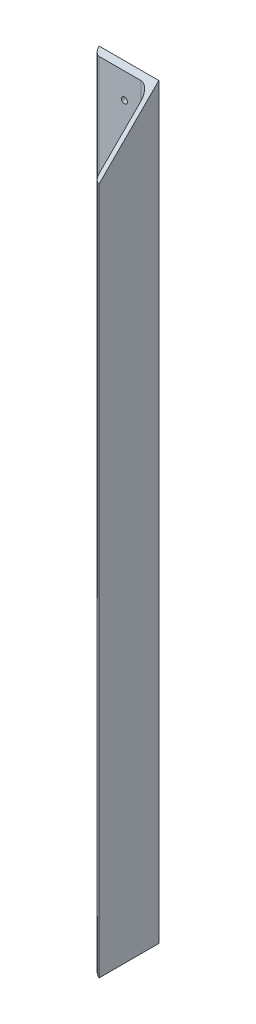
ISO-10303-21;
HEADER;
FILE_DESCRIPTION(('STEP AP214'),'2;1');
FILE_NAME('part.step','',(''),(''),'','','');
FILE_SCHEMA(('AUTOMOTIVE_DESIGN { 1 0 10303 214 1 1 1 1 }'));
ENDSEC;
DATA;
#1=APPLICATION_CONTEXT('core data for automotive mechanical design processes');
#2=APPLICATION_PROTOCOL_DEFINITION('international standard','automotive_design',2000,#1);
#3=PRODUCT_CONTEXT('',#1,'mechanical');
#4=PRODUCT('Part','Part','',(#3));
#5=PRODUCT_RELATED_PRODUCT_CATEGORY('part','',(#4));
#6=PRODUCT_DEFINITION_FORMATION('','',#4);
#7=PRODUCT_DEFINITION_CONTEXT('part definition',#1,'design');
#8=PRODUCT_DEFINITION('design','',#6,#7);
#9=PRODUCT_DEFINITION_SHAPE('','',#8);
#10=(LENGTH_UNIT() NAMED_UNIT(*) SI_UNIT(.MILLI.,.METRE.));
#11=(NAMED_UNIT(*) PLANE_ANGLE_UNIT() SI_UNIT($,.RADIAN.));
#12=(NAMED_UNIT(*) SI_UNIT($,.STERADIAN.) SOLID_ANGLE_UNIT());
#13=UNCERTAINTY_MEASURE_WITH_UNIT(LENGTH_MEASURE(1.E-05),#10,'distance_accuracy_value','');
#14=(GEOMETRIC_REPRESENTATION_CONTEXT(3) GLOBAL_UNCERTAINTY_ASSIGNED_CONTEXT((#13)) GLOBAL_UNIT_ASSIGNED_CONTEXT((#10,
#11,#12)) REPRESENTATION_CONTEXT('',''));
#15=CARTESIAN_POINT('',(0.,0.,0.));
#16=DIRECTION('',(0.,0.,1.));
#17=DIRECTION('',(1.,0.,0.));
#18=AXIS2_PLACEMENT_3D('',#15,#16,#17);
#19=CARTESIAN_POINT('',(0.,0.,40.));
#20=DIRECTION('',(-0.707106781186547,-0.707106781186547,0.));
#21=DIRECTION('',(0.707106781186548,-0.707106781186548,0.));
#22=AXIS2_PLACEMENT_3D('',#19,#20,#21);
#23=PLANE('',#22);
#24=DIRECTION('',(0.,0.,-1.));
#25=VECTOR('',#24,1.);
#26=CARTESIAN_POINT('',(-21.414213562373,21.414213562373,10.));
#27=LINE('',#26,#25);
#28=CARTESIAN_POINT('',(-21.414213562373,21.414213562373,3.));
#29=VERTEX_POINT('',#28);
#30=CARTESIAN_POINT('',(-21.414213562373,21.414213562373,0.));
#31=VERTEX_POINT('',#30);
#32=EDGE_CURVE('E13',#29,#31,#27,.T.);
#33=ORIENTED_EDGE('',*,*,#32,.F.);
#34=DIRECTION('',(-0.707106781186548,0.707106781186548,0.));
#35=VECTOR('',#34,1.);
#36=CARTESIAN_POINT('',(-254.5,254.5,3.));
#37=LINE('',#36,#35);
#38=CARTESIAN_POINT('',(-37.,37.,3.));
#39=VERTEX_POINT('',#38);
#40=EDGE_CURVE('E160',#29,#39,#37,.T.);
#41=ORIENTED_EDGE('',*,*,#40,.T.);
#42=CARTESIAN_POINT('',(-37.,37.,0.));
#43=DIRECTION('',(-0.707106781186547,-0.707106781186547,0.));
#44=DIRECTION('',(0.707106781186548,-0.707106781186548,0.));
#45=AXIS2_PLACEMENT_3D('',#42,#43,#44);
#46=ELLIPSE('',#45,4.24264068711928,3.);
#47=CARTESIAN_POINT('',(-40.,40.,0.));
#48=VERTEX_POINT('',#47);
#49=EDGE_CURVE('E146',#39,#48,#46,.T.);
#50=ORIENTED_EDGE('',*,*,#49,.T.);
#51=DIRECTION('',(-0.707106781186548,0.707106781186548,0.));
#52=VECTOR('',#51,1.);
#53=CARTESIAN_POINT('',(0.,0.,0.));
#54=LINE('',#53,#52);
#55=EDGE_CURVE('E139',#31,#48,#54,.T.);
#56=ORIENTED_EDGE('',*,*,#55,.F.);
#57=EDGE_LOOP('',(#33,#41,#50,#56));
#58=FACE_BOUND('',#57,.T.);
#59=ADVANCED_FACE('F62',(#58),#23,.T.);
#60=CARTESIAN_POINT('',(-37.,500.,0.));
#61=DIRECTION('',(0.,-1.,0.));
#62=DIRECTION('',(0.,0.,-1.));
#63=AXIS2_PLACEMENT_3D('',#60,#61,#62);
#64=CYLINDRICAL_SURFACE('',#63,3.);
#65=ORIENTED_EDGE('',*,*,#49,.F.);
#66=DIRECTION('',(0.,-1.,0.));
#67=VECTOR('',#66,1.);
#68=CARTESIAN_POINT('',(-37.,500.,3.));
#69=LINE('',#68,#67);
#70=CARTESIAN_POINT('',(-37.,497.,3.));
#71=VERTEX_POINT('',#70);
#72=EDGE_CURVE('E195',#71,#39,#69,.T.);
#73=ORIENTED_EDGE('',*,*,#72,.F.);
#74=CARTESIAN_POINT('',(-37.,500.,0.));
#75=DIRECTION('',(0.,0.707106781186548,0.707106781186547));
#76=DIRECTION('',(0.,-0.707106781186547,0.707106781186548));
#77=AXIS2_PLACEMENT_3D('',#74,#75,#76);
#78=ELLIPSE('',#77,4.24264068711928,3.);
#79=CARTESIAN_POINT('',(-40.,500.,0.));
#80=VERTEX_POINT('',#79);
#81=EDGE_CURVE('E174',#80,#71,#78,.T.);
#82=ORIENTED_EDGE('',*,*,#81,.F.);
#83=DIRECTION('',(0.,-1.,0.));
#84=VECTOR('',#83,1.);
#85=CARTESIAN_POINT('',(-40.,500.,0.));
#86=LINE('',#85,#84);
#87=EDGE_CURVE('E198',#80,#48,#86,.T.);
#88=ORIENTED_EDGE('',*,*,#87,.T.);
#89=EDGE_LOOP('',(#65,#73,#82,#88));
#90=FACE_BOUND('',#89,.T.);
#91=ADVANCED_FACE('F228',(#90),#64,.T.);
#92=CARTESIAN_POINT('',(-9.,500.,3.));
#93=DIRECTION('',(0.,0.,-1.));
#94=DIRECTION('',(-1.,0.,0.));
#95=AXIS2_PLACEMENT_3D('',#92,#93,#94);
#96=PLANE('',#95);
#97=CARTESIAN_POINT('',(-20.,480.,3.));
#98=DIRECTION('',(0.,0.,-1.));
#99=DIRECTION('',(-1.,0.,0.));
#100=AXIS2_PLACEMENT_3D('',#97,#98,#99);
#101=CIRCLE('',#100,2.);
#102=CARTESIAN_POINT('',(-22.,480.,3.));
#103=VERTEX_POINT('',#102);
#104=EDGE_CURVE('E148',#103,#103,#101,.T.);
#105=ORIENTED_EDGE('',*,*,#104,.T.);
#106=EDGE_LOOP('',(#105));
#107=FACE_BOUND('',#106,.T.);
#108=ORIENTED_EDGE('',*,*,#40,.F.);
#109=CARTESIAN_POINT('',(-20.0000000000001,19.9999999999997,3.));
#110=DIRECTION('',(0.,0.,-1.));
#111=DIRECTION('',(-1.,0.,0.));
#112=AXIS2_PLACEMENT_3D('',#109,#110,#111);
#113=CIRCLE('',#112,2.);
#114=CARTESIAN_POINT('',(-18.5857864376268,18.5857864376268,3.));
#115=VERTEX_POINT('',#114);
#116=EDGE_CURVE('E132',#29,#115,#113,.T.);
#117=ORIENTED_EDGE('',*,*,#116,.T.);
#118=CARTESIAN_POINT('',(-9.,9.00000000000001,3.));
#119=VERTEX_POINT('',#118);
#120=EDGE_CURVE('E161',#119,#115,#37,.T.);
#121=ORIENTED_EDGE('',*,*,#120,.F.);
#122=DIRECTION('',(0.,-1.,0.));
#123=VECTOR('',#122,1.);
#124=CARTESIAN_POINT('',(-9.,500.,3.));
#125=LINE('',#124,#123);
#126=CARTESIAN_POINT('',(-9.,497.,3.));
#127=VERTEX_POINT('',#126);
#128=EDGE_CURVE('E192',#127,#119,#125,.T.);
#129=ORIENTED_EDGE('',*,*,#128,.F.);
#130=DIRECTION('',(1.,0.,0.));
#131=VECTOR('',#130,1.);
#132=CARTESIAN_POINT('',(-9.,497.,3.));
#133=LINE('',#132,#131);
#134=EDGE_CURVE('E172',#71,#127,#133,.T.);
#135=ORIENTED_EDGE('',*,*,#134,.F.);
#136=ORIENTED_EDGE('',*,*,#72,.T.);
#137=EDGE_LOOP('',(#108,#117,#121,#129,#135,#136));
#138=FACE_BOUND('',#137,.T.);
#139=ADVANCED_FACE('F202',(#107,#138),#96,.F.);
#140=CARTESIAN_POINT('',(-9.,500.,9.));
#141=DIRECTION('',(0.,-1.,0.));
#142=DIRECTION('',(0.,0.,-1.));
#143=AXIS2_PLACEMENT_3D('',#140,#141,#142);
#144=CYLINDRICAL_SURFACE('',#143,6.);
#145=CARTESIAN_POINT('',(-9.,9.00000000000001,9.));
#146=DIRECTION('',(-0.707106781186547,-0.707106781186547,0.));
#147=DIRECTION('',(0.707106781186548,-0.707106781186548,0.));
#148=AXIS2_PLACEMENT_3D('',#145,#146,#147);
#149=ELLIPSE('',#148,8.48528137423857,6.);
#150=CARTESIAN_POINT('',(-3.,3.,9.));
#151=VERTEX_POINT('',#150);
#152=EDGE_CURVE('E158',#151,#119,#149,.F.);
#153=ORIENTED_EDGE('',*,*,#152,.F.);
#154=DIRECTION('',(0.,-1.,0.));
#155=VECTOR('',#154,1.);
#156=CARTESIAN_POINT('',(-3.,500.,9.));
#157=LINE('',#156,#155);
#158=CARTESIAN_POINT('',(-3.,491.,9.));
#159=VERTEX_POINT('',#158);
#160=EDGE_CURVE('E189',#159,#151,#157,.T.);
#161=ORIENTED_EDGE('',*,*,#160,.F.);
#162=CARTESIAN_POINT('',(-9.,491.,9.));
#163=DIRECTION('',(0.,0.707106781186548,0.707106781186547));
#164=DIRECTION('',(0.,-0.707106781186547,0.707106781186548));
#165=AXIS2_PLACEMENT_3D('',#162,#163,#164);
#166=ELLIPSE('',#165,8.48528137423857,6.);
#167=EDGE_CURVE('E170',#127,#159,#166,.F.);
#168=ORIENTED_EDGE('',*,*,#167,.F.);
#169=ORIENTED_EDGE('',*,*,#128,.T.);
#170=EDGE_LOOP('',(#153,#161,#168,#169));
#171=FACE_BOUND('',#170,.T.);
#172=ADVANCED_FACE('F209',(#171),#144,.F.);
#173=CARTESIAN_POINT('',(-3.,500.,37.));
#174=DIRECTION('',(1.,0.,0.));
#175=DIRECTION('',(0.,0.,-1.));
#176=AXIS2_PLACEMENT_3D('',#173,#174,#175);
#177=PLANE('',#176);
#178=DIRECTION('',(0.,0.,-1.));
#179=VECTOR('',#178,1.);
#180=CARTESIAN_POINT('',(-3.,3.,37.));
#181=LINE('',#180,#179);
#182=CARTESIAN_POINT('',(-3.,3.,37.));
#183=VERTEX_POINT('',#182);
#184=EDGE_CURVE('E156',#183,#151,#181,.T.);
#185=ORIENTED_EDGE('',*,*,#184,.F.);
#186=DIRECTION('',(0.,-1.,0.));
#187=VECTOR('',#186,1.);
#188=CARTESIAN_POINT('',(-3.,500.,37.));
#189=LINE('',#188,#187);
#190=CARTESIAN_POINT('',(-3.,463.,37.));
#191=VERTEX_POINT('',#190);
#192=EDGE_CURVE('E186',#191,#183,#189,.T.);
#193=ORIENTED_EDGE('',*,*,#192,.F.);
#194=DIRECTION('',(0.,-0.707106781186547,0.707106781186548));
#195=VECTOR('',#194,1.);
#196=CARTESIAN_POINT('',(-3.,481.5,18.5));
#197=LINE('',#196,#195);
#198=EDGE_CURVE('E168',#159,#191,#197,.T.);
#199=ORIENTED_EDGE('',*,*,#198,.F.);
#200=ORIENTED_EDGE('',*,*,#160,.T.);
#201=EDGE_LOOP('',(#185,#193,#199,#200));
#202=FACE_BOUND('',#201,.T.);
#203=ADVANCED_FACE('F213',(#202),#177,.F.);
#204=CARTESIAN_POINT('',(0.,500.,37.));
#205=DIRECTION('',(0.,-1.,0.));
#206=DIRECTION('',(0.,0.,-1.));
#207=AXIS2_PLACEMENT_3D('',#204,#205,#206);
#208=CYLINDRICAL_SURFACE('',#207,3.);
#209=CARTESIAN_POINT('',(0.,0.,37.));
#210=DIRECTION('',(-0.707106781186547,-0.707106781186547,0.));
#211=DIRECTION('',(0.707106781186548,-0.707106781186548,0.));
#212=AXIS2_PLACEMENT_3D('',#209,#210,#211);
#213=ELLIPSE('',#212,4.24264068711929,3.);
#214=CARTESIAN_POINT('',(0.,0.,40.));
#215=VERTEX_POINT('',#214);
#216=EDGE_CURVE('E150',#215,#183,#213,.T.);
#217=ORIENTED_EDGE('',*,*,#216,.F.);
#218=DIRECTION('',(0.,-1.,0.));
#219=VECTOR('',#218,1.);
#220=CARTESIAN_POINT('',(0.,500.,40.));
#221=LINE('',#220,#219);
#222=CARTESIAN_POINT('',(0.,460.,40.));
#223=VERTEX_POINT('',#222);
#224=EDGE_CURVE('E183',#223,#215,#221,.T.);
#225=ORIENTED_EDGE('',*,*,#224,.F.);
#226=CARTESIAN_POINT('',(0.,463.,37.));
#227=DIRECTION('',(0.,0.707106781186548,0.707106781186547));
#228=DIRECTION('',(0.,-0.707106781186547,0.707106781186548));
#229=AXIS2_PLACEMENT_3D('',#226,#227,#228);
#230=ELLIPSE('',#229,4.24264068711929,3.);
#231=EDGE_CURVE('E166',#191,#223,#230,.T.);
#232=ORIENTED_EDGE('',*,*,#231,.F.);
#233=ORIENTED_EDGE('',*,*,#192,.T.);
#234=EDGE_LOOP('',(#217,#225,#232,#233));
#235=FACE_BOUND('',#234,.T.);
#236=ADVANCED_FACE('F220',(#235),#208,.T.);
#237=CARTESIAN_POINT('',(-40.,500.,0.));
#238=DIRECTION('',(0.,0.,1.));
#239=DIRECTION('',(1.,0.,0.));
#240=AXIS2_PLACEMENT_3D('',#237,#238,#239);
#241=PLANE('',#240);
#242=CARTESIAN_POINT('',(-20.,480.,0.));
#243=DIRECTION('',(0.,0.,-1.));
#244=DIRECTION('',(-1.,0.,0.));
#245=AXIS2_PLACEMENT_3D('',#242,#243,#244);
#246=CIRCLE('',#245,2.);
#247=CARTESIAN_POINT('',(-22.,480.,0.));
#248=VERTEX_POINT('',#247);
#249=EDGE_CURVE('E143',#248,#248,#246,.T.);
#250=ORIENTED_EDGE('',*,*,#249,.F.);
#251=EDGE_LOOP('',(#250));
#252=FACE_BOUND('',#251,.T.);
#253=CARTESIAN_POINT('',(0.,0.,0.));
#254=VERTEX_POINT('',#253);
#255=CARTESIAN_POINT('',(-18.5857864376268,18.5857864376268,0.));
#256=VERTEX_POINT('',#255);
#257=EDGE_CURVE('E142',#254,#256,#54,.T.);
#258=ORIENTED_EDGE('',*,*,#257,.T.);
#259=CARTESIAN_POINT('',(-20.0000000000001,19.9999999999997,0.));
#260=DIRECTION('',(0.,0.,-1.));
#261=DIRECTION('',(-1.,0.,0.));
#262=AXIS2_PLACEMENT_3D('',#259,#260,#261);
#263=CIRCLE('',#262,2.);
#264=EDGE_CURVE('E76',#31,#256,#263,.T.);
#265=ORIENTED_EDGE('',*,*,#264,.F.);
#266=ORIENTED_EDGE('',*,*,#55,.T.);
#267=ORIENTED_EDGE('',*,*,#87,.F.);
#268=DIRECTION('',(-1.,0.,0.));
#269=VECTOR('',#268,1.);
#270=CARTESIAN_POINT('',(-40.,500.,0.));
#271=LINE('',#270,#269);
#272=CARTESIAN_POINT('',(0.,500.,0.));
#273=VERTEX_POINT('',#272);
#274=EDGE_CURVE('E177',#273,#80,#271,.T.);
#275=ORIENTED_EDGE('',*,*,#274,.F.);
#276=DIRECTION('',(0.,-1.,0.));
#277=VECTOR('',#276,1.);
#278=CARTESIAN_POINT('',(0.,500.,0.));
#279=LINE('',#278,#277);
#280=EDGE_CURVE('E179',#273,#254,#279,.T.);
#281=ORIENTED_EDGE('',*,*,#280,.T.);
#282=EDGE_LOOP('',(#258,#265,#266,#267,#275,#281));
#283=FACE_BOUND('',#282,.T.);
#284=ADVANCED_FACE('F64',(#252,#283),#241,.F.);
#285=CARTESIAN_POINT('',(0.,500.,40.));
#286=DIRECTION('',(-1.,0.,0.));
#287=DIRECTION('',(0.,0.,1.));
#288=AXIS2_PLACEMENT_3D('',#285,#286,#287);
#289=PLANE('',#288);
#290=DIRECTION('',(0.,-0.707106781186547,0.707106781186548));
#291=VECTOR('',#290,1.);
#292=CARTESIAN_POINT('',(0.,250.,250.));
#293=LINE('',#292,#291);
#294=EDGE_CURVE('E85',#273,#223,#293,.T.);
#295=ORIENTED_EDGE('',*,*,#294,.T.);
#296=ORIENTED_EDGE('',*,*,#224,.T.);
#297=DIRECTION('',(0.,0.,-1.));
#298=VECTOR('',#297,1.);
#299=CARTESIAN_POINT('',(0.,0.,40.));
#300=LINE('',#299,#298);
#301=EDGE_CURVE('E176',#215,#254,#300,.T.);
#302=ORIENTED_EDGE('',*,*,#301,.T.);
#303=ORIENTED_EDGE('',*,*,#280,.F.);
#304=EDGE_LOOP('',(#295,#296,#302,#303));
#305=FACE_BOUND('',#304,.T.);
#306=ADVANCED_FACE('F222',(#305),#289,.F.);
#307=CARTESIAN_POINT('',(-40.,250.,250.));
#308=DIRECTION('',(0.,0.707106781186548,0.707106781186547));
#309=DIRECTION('',(0.,-0.707106781186547,0.707106781186548));
#310=AXIS2_PLACEMENT_3D('',#307,#308,#309);
#311=PLANE('',#310);
#312=ORIENTED_EDGE('',*,*,#81,.T.);
#313=ORIENTED_EDGE('',*,*,#134,.T.);
#314=ORIENTED_EDGE('',*,*,#167,.T.);
#315=ORIENTED_EDGE('',*,*,#198,.T.);
#316=ORIENTED_EDGE('',*,*,#231,.T.);
#317=ORIENTED_EDGE('',*,*,#294,.F.);
#318=ORIENTED_EDGE('',*,*,#274,.T.);
#319=EDGE_LOOP('',(#312,#313,#314,#315,#316,#317,#318));
#320=FACE_BOUND('',#319,.T.);
#321=ADVANCED_FACE('F216',(#320),#311,.T.);
#322=DIRECTION('',(0.,0.,-1.));
#323=VECTOR('',#322,1.);
#324=CARTESIAN_POINT('',(-18.5857864376268,18.5857864376268,10.));
#325=LINE('',#324,#323);
#326=EDGE_CURVE('E70',#256,#115,#325,.F.);
#327=ORIENTED_EDGE('',*,*,#326,.F.);
#328=ORIENTED_EDGE('',*,*,#257,.F.);
#329=ORIENTED_EDGE('',*,*,#301,.F.);
#330=ORIENTED_EDGE('',*,*,#216,.T.);
#331=ORIENTED_EDGE('',*,*,#184,.T.);
#332=ORIENTED_EDGE('',*,*,#152,.T.);
#333=ORIENTED_EDGE('',*,*,#120,.T.);
#334=EDGE_LOOP('',(#327,#328,#329,#330,#331,#332,#333));
#335=FACE_BOUND('',#334,.T.);
#336=ADVANCED_FACE('F204',(#335),#23,.T.);
#337=CARTESIAN_POINT('',(-20.0000000000001,19.9999999999997,10.));
#338=DIRECTION('',(0.,0.,-1.));
#339=DIRECTION('',(-1.,0.,0.));
#340=AXIS2_PLACEMENT_3D('',#337,#338,#339);
#341=CYLINDRICAL_SURFACE('',#340,2.);
#342=ORIENTED_EDGE('',*,*,#32,.T.);
#343=ORIENTED_EDGE('',*,*,#264,.T.);
#344=ORIENTED_EDGE('',*,*,#326,.T.);
#345=ORIENTED_EDGE('',*,*,#116,.F.);
#346=EDGE_LOOP('',(#342,#343,#344,#345));
#347=FACE_BOUND('',#346,.T.);
#348=ADVANCED_FACE('F130',(#347),#341,.F.);
#349=CARTESIAN_POINT('',(-20.,480.,10.));
#350=DIRECTION('',(0.,0.,-1.));
#351=DIRECTION('',(-1.,0.,0.));
#352=AXIS2_PLACEMENT_3D('',#349,#350,#351);
#353=CYLINDRICAL_SURFACE('',#352,2.);
#354=ORIENTED_EDGE('',*,*,#249,.T.);
#355=EDGE_LOOP('',(#354));
#356=FACE_BOUND('',#355,.T.);
#357=ORIENTED_EDGE('',*,*,#104,.F.);
#358=EDGE_LOOP('',(#357));
#359=FACE_BOUND('',#358,.T.);
#360=ADVANCED_FACE('F252',(#356,#359),#353,.F.);
#361=CLOSED_SHELL('',(#59,#91,#139,#172,#203,#236,#284,#306,#321,#336,#348,#360));
#362=MANIFOLD_SOLID_BREP('B2',#361);
#363=ADVANCED_BREP_SHAPE_REPRESENTATION('',(#18,#362),#14);
#364=SHAPE_DEFINITION_REPRESENTATION(#9,#363);
ENDSEC;
END-ISO-10303-21;
